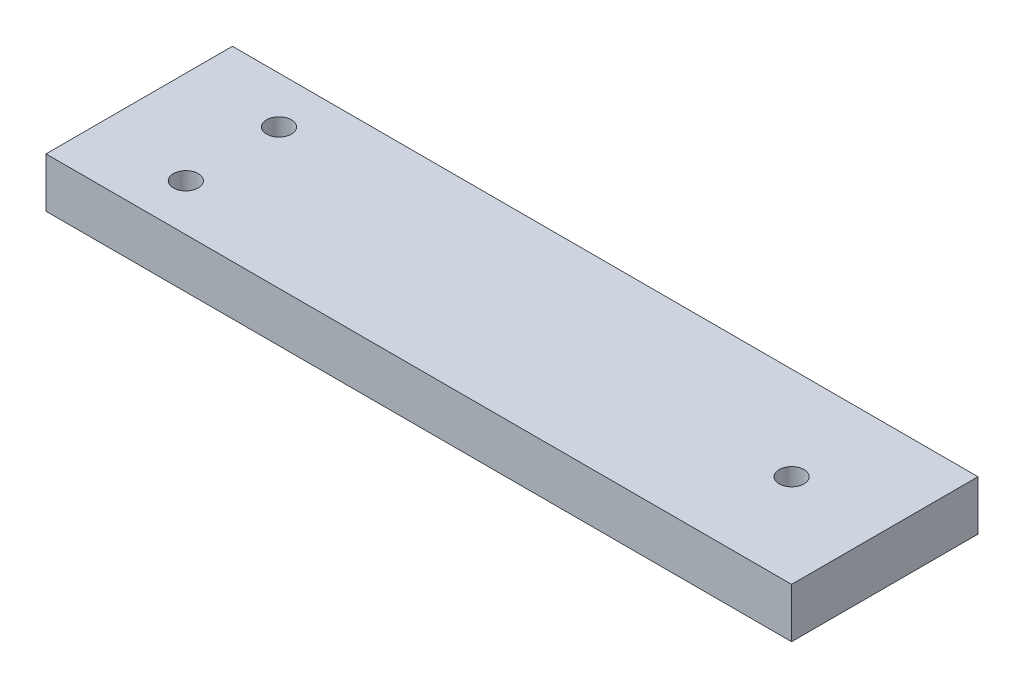
ISO-10303-21;
HEADER;
FILE_DESCRIPTION(('STEP AP214'),'2;1');
FILE_NAME('part.step','',(''),(''),'','','');
FILE_SCHEMA(('AUTOMOTIVE_DESIGN { 1 0 10303 214 1 1 1 1 }'));
ENDSEC;
DATA;
#1=APPLICATION_CONTEXT('core data for automotive mechanical design processes');
#2=APPLICATION_PROTOCOL_DEFINITION('international standard','automotive_design',2000,#1);
#3=PRODUCT_CONTEXT('',#1,'mechanical');
#4=PRODUCT('Part','Part','',(#3));
#5=PRODUCT_RELATED_PRODUCT_CATEGORY('part','',(#4));
#6=PRODUCT_DEFINITION_FORMATION('','',#4);
#7=PRODUCT_DEFINITION_CONTEXT('part definition',#1,'design');
#8=PRODUCT_DEFINITION('design','',#6,#7);
#9=PRODUCT_DEFINITION_SHAPE('','',#8);
#10=(LENGTH_UNIT() NAMED_UNIT(*) SI_UNIT(.MILLI.,.METRE.));
#11=(NAMED_UNIT(*) PLANE_ANGLE_UNIT() SI_UNIT($,.RADIAN.));
#12=(NAMED_UNIT(*) SI_UNIT($,.STERADIAN.) SOLID_ANGLE_UNIT());
#13=UNCERTAINTY_MEASURE_WITH_UNIT(LENGTH_MEASURE(1.E-05),#10,'distance_accuracy_value','');
#14=(GEOMETRIC_REPRESENTATION_CONTEXT(3) GLOBAL_UNCERTAINTY_ASSIGNED_CONTEXT((#13)) GLOBAL_UNIT_ASSIGNED_CONTEXT((#10,
#11,#12)) REPRESENTATION_CONTEXT('',''));
#15=CARTESIAN_POINT('',(0.,0.,0.));
#16=DIRECTION('',(0.,0.,1.));
#17=DIRECTION('',(1.,0.,0.));
#18=AXIS2_PLACEMENT_3D('',#15,#16,#17);
#19=CARTESIAN_POINT('',(0.,8.,0.));
#20=DIRECTION('',(0.,1.,0.));
#21=DIRECTION('',(0.,0.,1.));
#22=AXIS2_PLACEMENT_3D('',#19,#20,#21);
#23=PLANE('',#22);
#24=CARTESIAN_POINT('',(-45.,8.,7.5));
#25=DIRECTION('',(0.,1.,0.));
#26=DIRECTION('',(0.,0.,1.));
#27=AXIS2_PLACEMENT_3D('',#24,#25,#26);
#28=CIRCLE('',#27,2.);
#29=CARTESIAN_POINT('',(-45.,8.,9.5));
#30=VERTEX_POINT('',#29);
#31=EDGE_CURVE('E115',#30,#30,#28,.T.);
#32=ORIENTED_EDGE('',*,*,#31,.F.);
#33=EDGE_LOOP('',(#32));
#34=FACE_BOUND('',#33,.T.);
#35=DIRECTION('',(0.,0.,-1.));
#36=VECTOR('',#35,1.);
#37=CARTESIAN_POINT('',(60.,8.,-15.));
#38=LINE('',#37,#36);
#39=CARTESIAN_POINT('',(60.,8.,15.));
#40=VERTEX_POINT('',#39);
#41=CARTESIAN_POINT('',(60.,8.,-15.));
#42=VERTEX_POINT('',#41);
#43=EDGE_CURVE('E85',#40,#42,#38,.T.);
#44=ORIENTED_EDGE('',*,*,#43,.T.);
#45=DIRECTION('',(-1.,0.,0.));
#46=VECTOR('',#45,1.);
#47=CARTESIAN_POINT('',(-60.,8.,-15.));
#48=LINE('',#47,#46);
#49=CARTESIAN_POINT('',(-60.,8.,-15.));
#50=VERTEX_POINT('',#49);
#51=EDGE_CURVE('E80',#42,#50,#48,.T.);
#52=ORIENTED_EDGE('',*,*,#51,.T.);
#53=DIRECTION('',(0.,0.,1.));
#54=VECTOR('',#53,1.);
#55=CARTESIAN_POINT('',(-60.,8.,-15.));
#56=LINE('',#55,#54);
#57=CARTESIAN_POINT('',(-60.,8.,15.));
#58=VERTEX_POINT('',#57);
#59=EDGE_CURVE('E83',#50,#58,#56,.T.);
#60=ORIENTED_EDGE('',*,*,#59,.T.);
#61=DIRECTION('',(1.,0.,0.));
#62=VECTOR('',#61,1.);
#63=CARTESIAN_POINT('',(-60.,8.,15.));
#64=LINE('',#63,#62);
#65=EDGE_CURVE('E50',#58,#40,#64,.T.);
#66=ORIENTED_EDGE('',*,*,#65,.T.);
#67=EDGE_LOOP('',(#44,#52,#60,#66));
#68=FACE_BOUND('',#67,.T.);
#69=CARTESIAN_POINT('',(45.,8.,0.));
#70=DIRECTION('',(0.,1.,0.));
#71=DIRECTION('',(0.,0.,1.));
#72=AXIS2_PLACEMENT_3D('',#69,#70,#71);
#73=CIRCLE('',#72,2.);
#74=CARTESIAN_POINT('',(45.,8.,2.));
#75=VERTEX_POINT('',#74);
#76=EDGE_CURVE('E100',#75,#75,#73,.T.);
#77=ORIENTED_EDGE('',*,*,#76,.F.);
#78=EDGE_LOOP('',(#77));
#79=FACE_BOUND('',#78,.T.);
#80=CARTESIAN_POINT('',(-45.,8.,-7.5));
#81=DIRECTION('',(0.,1.,0.));
#82=DIRECTION('',(0.,0.,1.));
#83=AXIS2_PLACEMENT_3D('',#80,#81,#82);
#84=CIRCLE('',#83,2.);
#85=CARTESIAN_POINT('',(-45.,8.,-5.5));
#86=VERTEX_POINT('',#85);
#87=EDGE_CURVE('E121',#86,#86,#84,.T.);
#88=ORIENTED_EDGE('',*,*,#87,.F.);
#89=EDGE_LOOP('',(#88));
#90=FACE_BOUND('',#89,.T.);
#91=ADVANCED_FACE('F33',(#34,#68,#79,#90),#23,.T.);
#92=CARTESIAN_POINT('',(0.,0.,0.));
#93=DIRECTION('',(0.,1.,0.));
#94=DIRECTION('',(0.,0.,1.));
#95=AXIS2_PLACEMENT_3D('',#92,#93,#94);
#96=PLANE('',#95);
#97=DIRECTION('',(0.,0.,-1.));
#98=VECTOR('',#97,1.);
#99=CARTESIAN_POINT('',(60.,0.,-15.));
#100=LINE('',#99,#98);
#101=CARTESIAN_POINT('',(60.,0.,15.));
#102=VERTEX_POINT('',#101);
#103=CARTESIAN_POINT('',(60.,0.,-15.));
#104=VERTEX_POINT('',#103);
#105=EDGE_CURVE('E97',#102,#104,#100,.T.);
#106=ORIENTED_EDGE('',*,*,#105,.F.);
#107=DIRECTION('',(1.,0.,0.));
#108=VECTOR('',#107,1.);
#109=CARTESIAN_POINT('',(-60.,0.,15.));
#110=LINE('',#109,#108);
#111=CARTESIAN_POINT('',(-60.,0.,15.));
#112=VERTEX_POINT('',#111);
#113=EDGE_CURVE('E73',#112,#102,#110,.T.);
#114=ORIENTED_EDGE('',*,*,#113,.F.);
#115=DIRECTION('',(0.,0.,1.));
#116=VECTOR('',#115,1.);
#117=CARTESIAN_POINT('',(-60.,0.,-15.));
#118=LINE('',#117,#116);
#119=CARTESIAN_POINT('',(-60.,0.,-15.));
#120=VERTEX_POINT('',#119);
#121=EDGE_CURVE('E67',#120,#112,#118,.T.);
#122=ORIENTED_EDGE('',*,*,#121,.F.);
#123=DIRECTION('',(-1.,0.,0.));
#124=VECTOR('',#123,1.);
#125=CARTESIAN_POINT('',(-60.,0.,-15.));
#126=LINE('',#125,#124);
#127=EDGE_CURVE('E89',#104,#120,#126,.T.);
#128=ORIENTED_EDGE('',*,*,#127,.F.);
#129=EDGE_LOOP('',(#106,#114,#122,#128));
#130=FACE_BOUND('',#129,.T.);
#131=CARTESIAN_POINT('',(45.,0.,0.));
#132=DIRECTION('',(0.,1.,0.));
#133=DIRECTION('',(0.,0.,1.));
#134=AXIS2_PLACEMENT_3D('',#131,#132,#133);
#135=CIRCLE('',#134,2.);
#136=CARTESIAN_POINT('',(45.,0.,2.));
#137=VERTEX_POINT('',#136);
#138=EDGE_CURVE('E112',#137,#137,#135,.T.);
#139=ORIENTED_EDGE('',*,*,#138,.T.);
#140=EDGE_LOOP('',(#139));
#141=FACE_BOUND('',#140,.T.);
#142=CARTESIAN_POINT('',(-45.,0.,7.5));
#143=DIRECTION('',(0.,1.,0.));
#144=DIRECTION('',(0.,0.,1.));
#145=AXIS2_PLACEMENT_3D('',#142,#143,#144);
#146=CIRCLE('',#145,2.);
#147=CARTESIAN_POINT('',(-45.,0.,9.5));
#148=VERTEX_POINT('',#147);
#149=EDGE_CURVE('E118',#148,#148,#146,.T.);
#150=ORIENTED_EDGE('',*,*,#149,.T.);
#151=EDGE_LOOP('',(#150));
#152=FACE_BOUND('',#151,.T.);
#153=CARTESIAN_POINT('',(-45.,0.,-7.5));
#154=DIRECTION('',(0.,1.,0.));
#155=DIRECTION('',(0.,0.,1.));
#156=AXIS2_PLACEMENT_3D('',#153,#154,#155);
#157=CIRCLE('',#156,2.);
#158=CARTESIAN_POINT('',(-45.,0.,-5.5));
#159=VERTEX_POINT('',#158);
#160=EDGE_CURVE('E124',#159,#159,#157,.T.);
#161=ORIENTED_EDGE('',*,*,#160,.T.);
#162=EDGE_LOOP('',(#161));
#163=FACE_BOUND('',#162,.T.);
#164=ADVANCED_FACE('F108',(#130,#141,#152,#163),#96,.F.);
#165=CARTESIAN_POINT('',(60.,8.,-15.));
#166=DIRECTION('',(-1.,0.,0.));
#167=DIRECTION('',(0.,0.,1.));
#168=AXIS2_PLACEMENT_3D('',#165,#166,#167);
#169=PLANE('',#168);
#170=ORIENTED_EDGE('',*,*,#105,.T.);
#171=DIRECTION('',(0.,-1.,0.));
#172=VECTOR('',#171,1.);
#173=CARTESIAN_POINT('',(60.,8.,-15.));
#174=LINE('',#173,#172);
#175=EDGE_CURVE('E11',#42,#104,#174,.T.);
#176=ORIENTED_EDGE('',*,*,#175,.F.);
#177=ORIENTED_EDGE('',*,*,#43,.F.);
#178=DIRECTION('',(0.,-1.,0.));
#179=VECTOR('',#178,1.);
#180=CARTESIAN_POINT('',(60.,8.,15.));
#181=LINE('',#180,#179);
#182=EDGE_CURVE('E93',#40,#102,#181,.T.);
#183=ORIENTED_EDGE('',*,*,#182,.T.);
#184=EDGE_LOOP('',(#170,#176,#177,#183));
#185=FACE_BOUND('',#184,.T.);
#186=ADVANCED_FACE('F35',(#185),#169,.F.);
#187=CARTESIAN_POINT('',(-60.,8.,-15.));
#188=DIRECTION('',(0.,0.,1.));
#189=DIRECTION('',(1.,0.,0.));
#190=AXIS2_PLACEMENT_3D('',#187,#188,#189);
#191=PLANE('',#190);
#192=ORIENTED_EDGE('',*,*,#127,.T.);
#193=DIRECTION('',(0.,-1.,0.));
#194=VECTOR('',#193,1.);
#195=CARTESIAN_POINT('',(-60.,8.,-15.));
#196=LINE('',#195,#194);
#197=EDGE_CURVE('E42',#50,#120,#196,.T.);
#198=ORIENTED_EDGE('',*,*,#197,.F.);
#199=ORIENTED_EDGE('',*,*,#51,.F.);
#200=ORIENTED_EDGE('',*,*,#175,.T.);
#201=EDGE_LOOP('',(#192,#198,#199,#200));
#202=FACE_BOUND('',#201,.T.);
#203=ADVANCED_FACE('F88',(#202),#191,.F.);
#204=CARTESIAN_POINT('',(-60.,8.,-15.));
#205=DIRECTION('',(1.,0.,0.));
#206=DIRECTION('',(0.,0.,-1.));
#207=AXIS2_PLACEMENT_3D('',#204,#205,#206);
#208=PLANE('',#207);
#209=ORIENTED_EDGE('',*,*,#121,.T.);
#210=DIRECTION('',(0.,-1.,0.));
#211=VECTOR('',#210,1.);
#212=CARTESIAN_POINT('',(-60.,8.,15.));
#213=LINE('',#212,#211);
#214=EDGE_CURVE('E90',#58,#112,#213,.T.);
#215=ORIENTED_EDGE('',*,*,#214,.F.);
#216=ORIENTED_EDGE('',*,*,#59,.F.);
#217=ORIENTED_EDGE('',*,*,#197,.T.);
#218=EDGE_LOOP('',(#209,#215,#216,#217));
#219=FACE_BOUND('',#218,.T.);
#220=ADVANCED_FACE('F91',(#219),#208,.F.);
#221=CARTESIAN_POINT('',(-60.,8.,15.));
#222=DIRECTION('',(0.,0.,-1.));
#223=DIRECTION('',(-1.,0.,0.));
#224=AXIS2_PLACEMENT_3D('',#221,#222,#223);
#225=PLANE('',#224);
#226=ORIENTED_EDGE('',*,*,#113,.T.);
#227=ORIENTED_EDGE('',*,*,#182,.F.);
#228=ORIENTED_EDGE('',*,*,#65,.F.);
#229=ORIENTED_EDGE('',*,*,#214,.T.);
#230=EDGE_LOOP('',(#226,#227,#228,#229));
#231=FACE_BOUND('',#230,.T.);
#232=ADVANCED_FACE('F105',(#231),#225,.F.);
#233=CARTESIAN_POINT('',(45.,8.,0.));
#234=DIRECTION('',(0.,-1.,0.));
#235=DIRECTION('',(0.,0.,-1.));
#236=AXIS2_PLACEMENT_3D('',#233,#234,#235);
#237=CYLINDRICAL_SURFACE('',#236,2.);
#238=ORIENTED_EDGE('',*,*,#76,.T.);
#239=EDGE_LOOP('',(#238));
#240=FACE_BOUND('',#239,.T.);
#241=ORIENTED_EDGE('',*,*,#138,.F.);
#242=EDGE_LOOP('',(#241));
#243=FACE_BOUND('',#242,.T.);
#244=ADVANCED_FACE('F142',(#240,#243),#237,.F.);
#245=CARTESIAN_POINT('',(-45.,8.,7.5));
#246=DIRECTION('',(0.,-1.,0.));
#247=DIRECTION('',(0.,0.,-1.));
#248=AXIS2_PLACEMENT_3D('',#245,#246,#247);
#249=CYLINDRICAL_SURFACE('',#248,2.);
#250=ORIENTED_EDGE('',*,*,#31,.T.);
#251=EDGE_LOOP('',(#250));
#252=FACE_BOUND('',#251,.T.);
#253=ORIENTED_EDGE('',*,*,#149,.F.);
#254=EDGE_LOOP('',(#253));
#255=FACE_BOUND('',#254,.T.);
#256=ADVANCED_FACE('F188',(#252,#255),#249,.F.);
#257=CARTESIAN_POINT('',(-45.,8.,-7.5));
#258=DIRECTION('',(0.,-1.,0.));
#259=DIRECTION('',(0.,0.,-1.));
#260=AXIS2_PLACEMENT_3D('',#257,#258,#259);
#261=CYLINDRICAL_SURFACE('',#260,2.);
#262=ORIENTED_EDGE('',*,*,#87,.T.);
#263=EDGE_LOOP('',(#262));
#264=FACE_BOUND('',#263,.T.);
#265=ORIENTED_EDGE('',*,*,#160,.F.);
#266=EDGE_LOOP('',(#265));
#267=FACE_BOUND('',#266,.T.);
#268=ADVANCED_FACE('F130',(#264,#267),#261,.F.);
#269=CLOSED_SHELL('',(#91,#164,#186,#203,#220,#232,#244,#256,#268));
#270=MANIFOLD_SOLID_BREP('B2',#269);
#271=ADVANCED_BREP_SHAPE_REPRESENTATION('',(#18,#270),#14);
#272=SHAPE_DEFINITION_REPRESENTATION(#9,#271);
ENDSEC;
END-ISO-10303-21;
